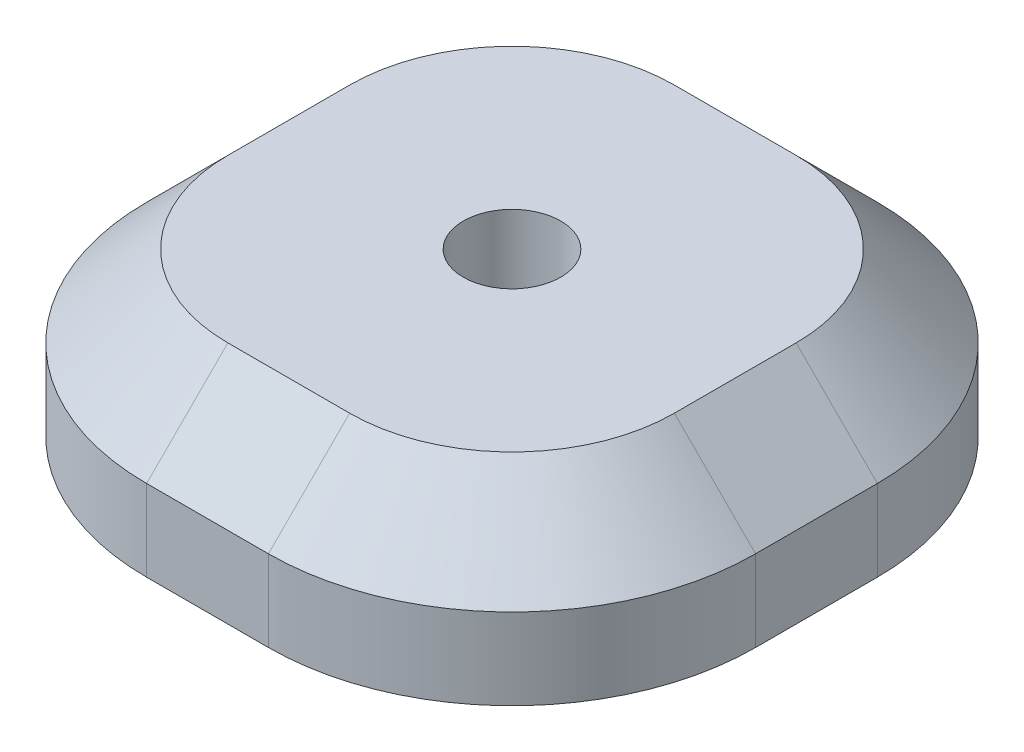
ISO-10303-21;
HEADER;
FILE_DESCRIPTION(('STEP AP214'),'2;1');
FILE_NAME('part.step','',(''),(''),'','','');
FILE_SCHEMA(('AUTOMOTIVE_DESIGN { 1 0 10303 214 1 1 1 1 }'));
ENDSEC;
DATA;
#1=APPLICATION_CONTEXT('core data for automotive mechanical design processes');
#2=APPLICATION_PROTOCOL_DEFINITION('international standard','automotive_design',2000,#1);
#3=PRODUCT_CONTEXT('',#1,'mechanical');
#4=PRODUCT('Part','Part','',(#3));
#5=PRODUCT_RELATED_PRODUCT_CATEGORY('part','',(#4));
#6=PRODUCT_DEFINITION_FORMATION('','',#4);
#7=PRODUCT_DEFINITION_CONTEXT('part definition',#1,'design');
#8=PRODUCT_DEFINITION('design','',#6,#7);
#9=PRODUCT_DEFINITION_SHAPE('','',#8);
#10=(LENGTH_UNIT() NAMED_UNIT(*) SI_UNIT(.MILLI.,.METRE.));
#11=(NAMED_UNIT(*) PLANE_ANGLE_UNIT() SI_UNIT($,.RADIAN.));
#12=(NAMED_UNIT(*) SI_UNIT($,.STERADIAN.) SOLID_ANGLE_UNIT());
#13=UNCERTAINTY_MEASURE_WITH_UNIT(LENGTH_MEASURE(1.E-05),#10,'distance_accuracy_value','');
#14=(GEOMETRIC_REPRESENTATION_CONTEXT(3) GLOBAL_UNCERTAINTY_ASSIGNED_CONTEXT((#13)) GLOBAL_UNIT_ASSIGNED_CONTEXT((#10,
#11,#12)) REPRESENTATION_CONTEXT('',''));
#15=CARTESIAN_POINT('',(0.,0.,0.));
#16=DIRECTION('',(0.,0.,1.));
#17=DIRECTION('',(1.,0.,0.));
#18=AXIS2_PLACEMENT_3D('',#15,#16,#17);
#19=CARTESIAN_POINT('',(-7.50000000000005,10.,7.49999999999993));
#20=DIRECTION('',(0.,-1.,0.));
#21=DIRECTION('',(0.,0.,-1.));
#22=AXIS2_PLACEMENT_3D('',#19,#20,#21);
#23=CYLINDRICAL_SURFACE('',#22,30.);
#24=DIRECTION('',(0.,-1.,0.));
#25=VECTOR('',#24,1.);
#26=CARTESIAN_POINT('',(-7.50000000000005,10.,37.5));
#27=LINE('',#26,#25);
#28=CARTESIAN_POINT('',(-7.50000000000005,0.,37.5));
#29=VERTEX_POINT('',#28);
#30=CARTESIAN_POINT('',(-7.50000000000005,-10.,37.5));
#31=VERTEX_POINT('',#30);
#32=EDGE_CURVE('E133',#29,#31,#27,.T.);
#33=ORIENTED_EDGE('',*,*,#32,.F.);
#34=CARTESIAN_POINT('',(-7.50000000000005,0.,7.49999999999993));
#35=DIRECTION('',(0.,-1.,0.));
#36=DIRECTION('',(0.,0.,-1.));
#37=AXIS2_PLACEMENT_3D('',#34,#35,#36);
#38=CIRCLE('',#37,30.);
#39=CARTESIAN_POINT('',(-37.5000000000001,0.,7.49999999999993));
#40=VERTEX_POINT('',#39);
#41=EDGE_CURVE('E12',#29,#40,#38,.T.);
#42=ORIENTED_EDGE('',*,*,#41,.T.);
#43=DIRECTION('',(0.,-1.,0.));
#44=VECTOR('',#43,1.);
#45=CARTESIAN_POINT('',(-37.5000000000001,10.,7.49999999999993));
#46=LINE('',#45,#44);
#47=CARTESIAN_POINT('',(-37.5000000000001,-10.,7.49999999999993));
#48=VERTEX_POINT('',#47);
#49=EDGE_CURVE('E156',#40,#48,#46,.T.);
#50=ORIENTED_EDGE('',*,*,#49,.T.);
#51=CARTESIAN_POINT('',(-7.50000000000005,-10.,7.49999999999993));
#52=DIRECTION('',(0.,1.,0.));
#53=DIRECTION('',(0.,0.,-1.));
#54=AXIS2_PLACEMENT_3D('',#51,#52,#53);
#55=CIRCLE('',#54,30.);
#56=EDGE_CURVE('E149',#48,#31,#55,.T.);
#57=ORIENTED_EDGE('',*,*,#56,.T.);
#58=EDGE_LOOP('',(#33,#42,#50,#57));
#59=FACE_BOUND('',#58,.T.);
#60=ADVANCED_FACE('F43',(#59),#23,.T.);
#61=CARTESIAN_POINT('',(7.50000000000005,10.,37.5));
#62=DIRECTION('',(0.,0.,-1.));
#63=DIRECTION('',(-1.,0.,0.));
#64=AXIS2_PLACEMENT_3D('',#61,#62,#63);
#65=PLANE('',#64);
#66=DIRECTION('',(0.,-1.,0.));
#67=VECTOR('',#66,1.);
#68=CARTESIAN_POINT('',(7.50000000000005,10.,37.5));
#69=LINE('',#68,#67);
#70=CARTESIAN_POINT('',(7.50000000000005,0.,37.5));
#71=VERTEX_POINT('',#70);
#72=CARTESIAN_POINT('',(7.50000000000005,-10.,37.5));
#73=VERTEX_POINT('',#72);
#74=EDGE_CURVE('E143',#71,#73,#69,.T.);
#75=ORIENTED_EDGE('',*,*,#74,.F.);
#76=DIRECTION('',(-1.,0.,0.));
#77=VECTOR('',#76,1.);
#78=CARTESIAN_POINT('',(7.50000000000005,0.,37.5));
#79=LINE('',#78,#77);
#80=EDGE_CURVE('E54',#71,#29,#79,.T.);
#81=ORIENTED_EDGE('',*,*,#80,.T.);
#82=ORIENTED_EDGE('',*,*,#32,.T.);
#83=DIRECTION('',(1.,0.,0.));
#84=VECTOR('',#83,1.);
#85=CARTESIAN_POINT('',(7.50000000000005,-10.,37.5));
#86=LINE('',#85,#84);
#87=EDGE_CURVE('E136',#31,#73,#86,.T.);
#88=ORIENTED_EDGE('',*,*,#87,.T.);
#89=EDGE_LOOP('',(#75,#81,#82,#88));
#90=FACE_BOUND('',#89,.T.);
#91=ADVANCED_FACE('F135',(#90),#65,.F.);
#92=CARTESIAN_POINT('',(7.50000000000005,10.,7.49999999999993));
#93=DIRECTION('',(0.,-1.,0.));
#94=DIRECTION('',(0.,0.,-1.));
#95=AXIS2_PLACEMENT_3D('',#92,#93,#94);
#96=CYLINDRICAL_SURFACE('',#95,30.);
#97=DIRECTION('',(0.,-1.,0.));
#98=VECTOR('',#97,1.);
#99=CARTESIAN_POINT('',(37.5000000000001,10.,7.49999999999993));
#100=LINE('',#99,#98);
#101=CARTESIAN_POINT('',(37.5000000000001,0.,7.49999999999993));
#102=VERTEX_POINT('',#101);
#103=CARTESIAN_POINT('',(37.5000000000001,-10.,7.49999999999993));
#104=VERTEX_POINT('',#103);
#105=EDGE_CURVE('E202',#102,#104,#100,.T.);
#106=ORIENTED_EDGE('',*,*,#105,.F.);
#107=CARTESIAN_POINT('',(7.50000000000005,0.,7.49999999999993));
#108=DIRECTION('',(0.,-1.,0.));
#109=DIRECTION('',(0.,0.,-1.));
#110=AXIS2_PLACEMENT_3D('',#107,#108,#109);
#111=CIRCLE('',#110,30.);
#112=EDGE_CURVE('E69',#102,#71,#111,.T.);
#113=ORIENTED_EDGE('',*,*,#112,.T.);
#114=ORIENTED_EDGE('',*,*,#74,.T.);
#115=CARTESIAN_POINT('',(7.50000000000005,-10.,7.49999999999993));
#116=DIRECTION('',(0.,1.,0.));
#117=DIRECTION('',(0.,0.,-1.));
#118=AXIS2_PLACEMENT_3D('',#115,#116,#117);
#119=CIRCLE('',#118,30.);
#120=EDGE_CURVE('E152',#73,#104,#119,.T.);
#121=ORIENTED_EDGE('',*,*,#120,.T.);
#122=EDGE_LOOP('',(#106,#113,#114,#121));
#123=FACE_BOUND('',#122,.T.);
#124=ADVANCED_FACE('F329',(#123),#96,.T.);
#125=CARTESIAN_POINT('',(37.5000000000001,10.,-7.49999999999993));
#126=DIRECTION('',(-1.,0.,0.));
#127=DIRECTION('',(0.,0.,1.));
#128=AXIS2_PLACEMENT_3D('',#125,#126,#127);
#129=PLANE('',#128);
#130=DIRECTION('',(0.,-1.,0.));
#131=VECTOR('',#130,1.);
#132=CARTESIAN_POINT('',(37.5000000000001,10.,-7.49999999999993));
#133=LINE('',#132,#131);
#134=CARTESIAN_POINT('',(37.5000000000001,0.,-7.49999999999993));
#135=VERTEX_POINT('',#134);
#136=CARTESIAN_POINT('',(37.5000000000001,-10.,-7.49999999999993));
#137=VERTEX_POINT('',#136);
#138=EDGE_CURVE('E199',#135,#137,#133,.T.);
#139=ORIENTED_EDGE('',*,*,#138,.F.);
#140=DIRECTION('',(0.,0.,1.));
#141=VECTOR('',#140,1.);
#142=CARTESIAN_POINT('',(37.5000000000001,0.,-7.49999999999993));
#143=LINE('',#142,#141);
#144=EDGE_CURVE('E244',#135,#102,#143,.T.);
#145=ORIENTED_EDGE('',*,*,#144,.T.);
#146=ORIENTED_EDGE('',*,*,#105,.T.);
#147=DIRECTION('',(0.,0.,-1.));
#148=VECTOR('',#147,1.);
#149=CARTESIAN_POINT('',(37.5000000000001,-10.,-7.49999999999993));
#150=LINE('',#149,#148);
#151=EDGE_CURVE('E169',#104,#137,#150,.T.);
#152=ORIENTED_EDGE('',*,*,#151,.T.);
#153=EDGE_LOOP('',(#139,#145,#146,#152));
#154=FACE_BOUND('',#153,.T.);
#155=ADVANCED_FACE('F327',(#154),#129,.F.);
#156=CARTESIAN_POINT('',(7.49999999999995,10.,-7.49999999999995));
#157=DIRECTION('',(0.,-1.,0.));
#158=DIRECTION('',(0.,0.,-1.));
#159=AXIS2_PLACEMENT_3D('',#156,#157,#158);
#160=CYLINDRICAL_SURFACE('',#159,30.0000000000001);
#161=DIRECTION('',(0.,-1.,0.));
#162=VECTOR('',#161,1.);
#163=CARTESIAN_POINT('',(7.50000000000005,10.,-37.5));
#164=LINE('',#163,#162);
#165=CARTESIAN_POINT('',(7.50000000000005,0.,-37.5));
#166=VERTEX_POINT('',#165);
#167=CARTESIAN_POINT('',(7.50000000000005,-10.,-37.5));
#168=VERTEX_POINT('',#167);
#169=EDGE_CURVE('E196',#166,#168,#164,.T.);
#170=ORIENTED_EDGE('',*,*,#169,.F.);
#171=CARTESIAN_POINT('',(7.49999999999995,0.,-7.49999999999995));
#172=DIRECTION('',(0.,-1.,0.));
#173=DIRECTION('',(0.,0.,-1.));
#174=AXIS2_PLACEMENT_3D('',#171,#172,#173);
#175=CIRCLE('',#174,30.0000000000001);
#176=EDGE_CURVE('E241',#166,#135,#175,.T.);
#177=ORIENTED_EDGE('',*,*,#176,.T.);
#178=ORIENTED_EDGE('',*,*,#138,.T.);
#179=CARTESIAN_POINT('',(7.49999999999995,-10.,-7.49999999999995));
#180=DIRECTION('',(0.,1.,0.));
#181=DIRECTION('',(0.,0.,-1.));
#182=AXIS2_PLACEMENT_3D('',#179,#180,#181);
#183=CIRCLE('',#182,30.0000000000001);
#184=EDGE_CURVE('E173',#137,#168,#183,.T.);
#185=ORIENTED_EDGE('',*,*,#184,.T.);
#186=EDGE_LOOP('',(#170,#177,#178,#185));
#187=FACE_BOUND('',#186,.T.);
#188=ADVANCED_FACE('F325',(#187),#160,.T.);
#189=CARTESIAN_POINT('',(-7.50000000000005,10.,-37.5));
#190=DIRECTION('',(0.,0.,1.));
#191=DIRECTION('',(1.,0.,0.));
#192=AXIS2_PLACEMENT_3D('',#189,#190,#191);
#193=PLANE('',#192);
#194=DIRECTION('',(0.,-1.,0.));
#195=VECTOR('',#194,1.);
#196=CARTESIAN_POINT('',(-7.50000000000005,10.,-37.5));
#197=LINE('',#196,#195);
#198=CARTESIAN_POINT('',(-7.50000000000005,0.,-37.5));
#199=VERTEX_POINT('',#198);
#200=CARTESIAN_POINT('',(-7.50000000000005,-10.,-37.5));
#201=VERTEX_POINT('',#200);
#202=EDGE_CURVE('E193',#199,#201,#197,.T.);
#203=ORIENTED_EDGE('',*,*,#202,.F.);
#204=DIRECTION('',(1.,0.,0.));
#205=VECTOR('',#204,1.);
#206=CARTESIAN_POINT('',(-7.50000000000005,0.,-37.5));
#207=LINE('',#206,#205);
#208=EDGE_CURVE('E238',#199,#166,#207,.T.);
#209=ORIENTED_EDGE('',*,*,#208,.T.);
#210=ORIENTED_EDGE('',*,*,#169,.T.);
#211=DIRECTION('',(-1.,0.,0.));
#212=VECTOR('',#211,1.);
#213=CARTESIAN_POINT('',(-7.50000000000005,-10.,-37.5));
#214=LINE('',#213,#212);
#215=EDGE_CURVE('E177',#168,#201,#214,.T.);
#216=ORIENTED_EDGE('',*,*,#215,.T.);
#217=EDGE_LOOP('',(#203,#209,#210,#216));
#218=FACE_BOUND('',#217,.T.);
#219=ADVANCED_FACE('F313',(#218),#193,.F.);
#220=CARTESIAN_POINT('',(-7.49999999999995,10.,-7.49999999999993));
#221=DIRECTION('',(0.,-1.,0.));
#222=DIRECTION('',(0.,0.,-1.));
#223=AXIS2_PLACEMENT_3D('',#220,#221,#222);
#224=CYLINDRICAL_SURFACE('',#223,30.0000000000001);
#225=DIRECTION('',(0.,-1.,0.));
#226=VECTOR('',#225,1.);
#227=CARTESIAN_POINT('',(-37.5,10.,-7.49999999999994));
#228=LINE('',#227,#226);
#229=CARTESIAN_POINT('',(-37.5,0.,-7.49999999999994));
#230=VERTEX_POINT('',#229);
#231=CARTESIAN_POINT('',(-37.5,-10.,-7.49999999999994));
#232=VERTEX_POINT('',#231);
#233=EDGE_CURVE('E190',#230,#232,#228,.T.);
#234=ORIENTED_EDGE('',*,*,#233,.F.);
#235=CARTESIAN_POINT('',(-7.49999999999995,0.,-7.49999999999993));
#236=DIRECTION('',(0.,-1.,0.));
#237=DIRECTION('',(0.,0.,-1.));
#238=AXIS2_PLACEMENT_3D('',#235,#236,#237);
#239=CIRCLE('',#238,30.0000000000001);
#240=EDGE_CURVE('E235',#230,#199,#239,.T.);
#241=ORIENTED_EDGE('',*,*,#240,.T.);
#242=ORIENTED_EDGE('',*,*,#202,.T.);
#243=CARTESIAN_POINT('',(-7.49999999999995,-10.,-7.49999999999993));
#244=DIRECTION('',(0.,1.,0.));
#245=DIRECTION('',(0.,0.,1.));
#246=AXIS2_PLACEMENT_3D('',#243,#244,#245);
#247=CIRCLE('',#246,30.0000000000001);
#248=EDGE_CURVE('E181',#201,#232,#247,.T.);
#249=ORIENTED_EDGE('',*,*,#248,.T.);
#250=EDGE_LOOP('',(#234,#241,#242,#249));
#251=FACE_BOUND('',#250,.T.);
#252=ADVANCED_FACE('F310',(#251),#224,.T.);
#253=CARTESIAN_POINT('',(-37.5000000000001,10.,7.49999999999993));
#254=DIRECTION('',(1.,0.,0.));
#255=DIRECTION('',(0.,0.,-1.));
#256=AXIS2_PLACEMENT_3D('',#253,#254,#255);
#257=PLANE('',#256);
#258=ORIENTED_EDGE('',*,*,#49,.F.);
#259=DIRECTION('',(0.,0.,-1.));
#260=VECTOR('',#259,1.);
#261=CARTESIAN_POINT('',(-37.5000000000001,0.,7.49999999999993));
#262=LINE('',#261,#260);
#263=EDGE_CURVE('E231',#40,#230,#262,.T.);
#264=ORIENTED_EDGE('',*,*,#263,.T.);
#265=ORIENTED_EDGE('',*,*,#233,.T.);
#266=DIRECTION('',(0.,0.,1.));
#267=VECTOR('',#266,1.);
#268=CARTESIAN_POINT('',(-37.5000000000001,-10.,7.49999999999993));
#269=LINE('',#268,#267);
#270=EDGE_CURVE('E185',#232,#48,#269,.T.);
#271=ORIENTED_EDGE('',*,*,#270,.T.);
#272=EDGE_LOOP('',(#258,#264,#265,#271));
#273=FACE_BOUND('',#272,.T.);
#274=ADVANCED_FACE('F297',(#273),#257,.F.);
#275=CARTESIAN_POINT('',(-7.50000000000005,10.,7.49999999999993));
#276=DIRECTION('',(0.,-1.,0.));
#277=DIRECTION('',(0.,0.,-1.));
#278=AXIS2_PLACEMENT_3D('',#275,#276,#277);
#279=PLANE('',#278);
#280=CARTESIAN_POINT('',(0.,10.,0.));
#281=DIRECTION('',(0.,1.,0.));
#282=DIRECTION('',(0.,0.,1.));
#283=AXIS2_PLACEMENT_3D('',#280,#281,#282);
#284=CIRCLE('',#283,6.);
#285=CARTESIAN_POINT('',(0.,10.,6.));
#286=VERTEX_POINT('',#285);
#287=EDGE_CURVE('E522',#286,#286,#284,.T.);
#288=ORIENTED_EDGE('',*,*,#287,.F.);
#289=EDGE_LOOP('',(#288));
#290=FACE_BOUND('',#289,.T.);
#291=CARTESIAN_POINT('',(-7.49999999999995,10.,-7.49999999999993));
#292=DIRECTION('',(0.,-1.,0.));
#293=DIRECTION('',(0.,0.,-1.));
#294=AXIS2_PLACEMENT_3D('',#291,#292,#293);
#295=CIRCLE('',#294,20.);
#296=CARTESIAN_POINT('',(-7.50000000000002,10.,-27.4999999999999));
#297=VERTEX_POINT('',#296);
#298=CARTESIAN_POINT('',(-27.5,10.,-7.49999999999994));
#299=VERTEX_POINT('',#298);
#300=EDGE_CURVE('E224',#297,#299,#295,.F.);
#301=ORIENTED_EDGE('',*,*,#300,.T.);
#302=DIRECTION('',(0.,0.,1.));
#303=VECTOR('',#302,1.);
#304=CARTESIAN_POINT('',(-27.5,10.,7.49999999999993));
#305=LINE('',#304,#303);
#306=CARTESIAN_POINT('',(-27.5,10.,7.49999999999993));
#307=VERTEX_POINT('',#306);
#308=EDGE_CURVE('E227',#299,#307,#305,.T.);
#309=ORIENTED_EDGE('',*,*,#308,.T.);
#310=CARTESIAN_POINT('',(-7.50000000000005,10.,7.49999999999993));
#311=DIRECTION('',(0.,-1.,0.));
#312=DIRECTION('',(0.,0.,-1.));
#313=AXIS2_PLACEMENT_3D('',#310,#311,#312);
#314=CIRCLE('',#313,20.);
#315=CARTESIAN_POINT('',(-7.50000000000005,10.,27.4999999999999));
#316=VERTEX_POINT('',#315);
#317=EDGE_CURVE('E142',#307,#316,#314,.F.);
#318=ORIENTED_EDGE('',*,*,#317,.T.);
#319=DIRECTION('',(1.,0.,0.));
#320=VECTOR('',#319,1.);
#321=CARTESIAN_POINT('',(-7.50000000000005,10.,27.4999999999999));
#322=LINE('',#321,#320);
#323=CARTESIAN_POINT('',(7.50000000000005,10.,27.4999999999999));
#324=VERTEX_POINT('',#323);
#325=EDGE_CURVE('E209',#316,#324,#322,.T.);
#326=ORIENTED_EDGE('',*,*,#325,.T.);
#327=CARTESIAN_POINT('',(7.50000000000005,10.,7.49999999999993));
#328=DIRECTION('',(0.,-1.,0.));
#329=DIRECTION('',(0.,0.,-1.));
#330=AXIS2_PLACEMENT_3D('',#327,#328,#329);
#331=CIRCLE('',#330,20.);
#332=CARTESIAN_POINT('',(27.5,10.,7.49999999999993));
#333=VERTEX_POINT('',#332);
#334=EDGE_CURVE('E212',#324,#333,#331,.F.);
#335=ORIENTED_EDGE('',*,*,#334,.T.);
#336=DIRECTION('',(0.,0.,-1.));
#337=VECTOR('',#336,1.);
#338=CARTESIAN_POINT('',(27.5,10.,7.49999999999993));
#339=LINE('',#338,#337);
#340=CARTESIAN_POINT('',(27.5,10.,-7.49999999999994));
#341=VERTEX_POINT('',#340);
#342=EDGE_CURVE('E215',#333,#341,#339,.T.);
#343=ORIENTED_EDGE('',*,*,#342,.T.);
#344=CARTESIAN_POINT('',(7.49999999999995,10.,-7.49999999999995));
#345=DIRECTION('',(0.,-1.,0.));
#346=DIRECTION('',(0.,0.,-1.));
#347=AXIS2_PLACEMENT_3D('',#344,#345,#346);
#348=CIRCLE('',#347,20.);
#349=CARTESIAN_POINT('',(7.50000000000005,10.,-27.5));
#350=VERTEX_POINT('',#349);
#351=EDGE_CURVE('E218',#341,#350,#348,.F.);
#352=ORIENTED_EDGE('',*,*,#351,.T.);
#353=DIRECTION('',(-1.,0.,0.));
#354=VECTOR('',#353,1.);
#355=CARTESIAN_POINT('',(-7.50000000000005,10.,-27.4999999999999));
#356=LINE('',#355,#354);
#357=EDGE_CURVE('E221',#350,#297,#356,.T.);
#358=ORIENTED_EDGE('',*,*,#357,.T.);
#359=EDGE_LOOP('',(#301,#309,#318,#326,#335,#343,#352,#358));
#360=FACE_BOUND('',#359,.T.);
#361=ADVANCED_FACE('F285',(#290,#360),#279,.F.);
#362=CARTESIAN_POINT('',(-7.50000000000005,-10.,7.49999999999993));
#363=DIRECTION('',(0.,-1.,0.));
#364=DIRECTION('',(0.,0.,-1.));
#365=AXIS2_PLACEMENT_3D('',#362,#363,#364);
#366=PLANE('',#365);
#367=CARTESIAN_POINT('',(-12.5,-10.,12.5));
#368=DIRECTION('',(0.,-1.,0.));
#369=DIRECTION('',(0.,0.,1.));
#370=AXIS2_PLACEMENT_3D('',#367,#368,#369);
#371=CIRCLE('',#370,6.);
#372=CARTESIAN_POINT('',(-12.5,-10.,18.5));
#373=VERTEX_POINT('',#372);
#374=EDGE_CURVE('E496',#373,#373,#371,.T.);
#375=ORIENTED_EDGE('',*,*,#374,.F.);
#376=EDGE_LOOP('',(#375));
#377=FACE_BOUND('',#376,.T.);
#378=CARTESIAN_POINT('',(12.5000000000001,-10.,-12.5));
#379=DIRECTION('',(0.,-1.,0.));
#380=DIRECTION('',(0.,0.,1.));
#381=AXIS2_PLACEMENT_3D('',#378,#379,#380);
#382=CIRCLE('',#381,6.00000000000001);
#383=CARTESIAN_POINT('',(12.5000000000001,-10.,-6.49999999999996));
#384=VERTEX_POINT('',#383);
#385=EDGE_CURVE('E503',#384,#384,#382,.T.);
#386=ORIENTED_EDGE('',*,*,#385,.F.);
#387=EDGE_LOOP('',(#386));
#388=FACE_BOUND('',#387,.T.);
#389=CARTESIAN_POINT('',(-12.5,-10.,-12.5));
#390=DIRECTION('',(0.,-1.,0.));
#391=DIRECTION('',(0.,0.,-1.));
#392=AXIS2_PLACEMENT_3D('',#389,#390,#391);
#393=CIRCLE('',#392,6.);
#394=CARTESIAN_POINT('',(-12.5,-10.,-18.5));
#395=VERTEX_POINT('',#394);
#396=EDGE_CURVE('E514',#395,#395,#393,.T.);
#397=ORIENTED_EDGE('',*,*,#396,.F.);
#398=EDGE_LOOP('',(#397));
#399=FACE_BOUND('',#398,.T.);
#400=CARTESIAN_POINT('',(12.5000000000001,-10.,12.5));
#401=DIRECTION('',(0.,-1.,0.));
#402=DIRECTION('',(0.,0.,-1.));
#403=AXIS2_PLACEMENT_3D('',#400,#401,#402);
#404=CIRCLE('',#403,6.00000000000001);
#405=CARTESIAN_POINT('',(12.5000000000001,-10.,6.49999999999996));
#406=VERTEX_POINT('',#405);
#407=EDGE_CURVE('E489',#406,#406,#404,.T.);
#408=ORIENTED_EDGE('',*,*,#407,.F.);
#409=EDGE_LOOP('',(#408));
#410=FACE_BOUND('',#409,.T.);
#411=ORIENTED_EDGE('',*,*,#56,.F.);
#412=ORIENTED_EDGE('',*,*,#270,.F.);
#413=ORIENTED_EDGE('',*,*,#248,.F.);
#414=ORIENTED_EDGE('',*,*,#215,.F.);
#415=ORIENTED_EDGE('',*,*,#184,.F.);
#416=ORIENTED_EDGE('',*,*,#151,.F.);
#417=ORIENTED_EDGE('',*,*,#120,.F.);
#418=ORIENTED_EDGE('',*,*,#87,.F.);
#419=EDGE_LOOP('',(#411,#412,#413,#414,#415,#416,#417,#418));
#420=FACE_BOUND('',#419,.T.);
#421=ADVANCED_FACE('F147',(#377,#388,#399,#410,#420),#366,.T.);
#422=CARTESIAN_POINT('',(27.5,10.,7.49999999999993));
#423=DIRECTION('',(-0.707106781186549,-0.707106781186546,0.));
#424=DIRECTION('',(0.,0.,-1.));
#425=AXIS2_PLACEMENT_3D('',#422,#423,#424);
#426=PLANE('',#425);
#427=DIRECTION('',(-0.707106781186546,0.707106781186549,0.));
#428=VECTOR('',#427,1.);
#429=CARTESIAN_POINT('',(37.5000000000001,0.,7.49999999999993));
#430=LINE('',#429,#428);
#431=EDGE_CURVE('E162',#102,#333,#430,.T.);
#432=ORIENTED_EDGE('',*,*,#431,.F.);
#433=ORIENTED_EDGE('',*,*,#144,.F.);
#434=DIRECTION('',(0.707106781186546,-0.707106781186549,0.));
#435=VECTOR('',#434,1.);
#436=CARTESIAN_POINT('',(27.5,10.,-7.49999999999994));
#437=LINE('',#436,#435);
#438=EDGE_CURVE('E48',#341,#135,#437,.T.);
#439=ORIENTED_EDGE('',*,*,#438,.F.);
#440=ORIENTED_EDGE('',*,*,#342,.F.);
#441=EDGE_LOOP('',(#432,#433,#439,#440));
#442=FACE_BOUND('',#441,.T.);
#443=ADVANCED_FACE('F46',(#442),#426,.F.);
#444=CARTESIAN_POINT('',(7.49999999999995,10.,-7.49999999999995));
#445=DIRECTION('',(0.,-1.,0.));
#446=DIRECTION('',(0.,0.,-1.));
#447=AXIS2_PLACEMENT_3D('',#444,#445,#446);
#448=CONICAL_SURFACE('',#447,20.,0.785398163397447);
#449=ORIENTED_EDGE('',*,*,#438,.T.);
#450=ORIENTED_EDGE('',*,*,#176,.F.);
#451=DIRECTION('',(0.,-0.707106781186549,-0.707106781186546));
#452=VECTOR('',#451,1.);
#453=CARTESIAN_POINT('',(7.50000000000005,10.,-27.5));
#454=LINE('',#453,#452);
#455=EDGE_CURVE('E269',#350,#166,#454,.T.);
#456=ORIENTED_EDGE('',*,*,#455,.F.);
#457=ORIENTED_EDGE('',*,*,#351,.F.);
#458=EDGE_LOOP('',(#449,#450,#456,#457));
#459=FACE_BOUND('',#458,.T.);
#460=ADVANCED_FACE('F322',(#459),#448,.T.);
#461=CARTESIAN_POINT('',(7.50000000000005,10.,7.49999999999993));
#462=DIRECTION('',(0.,-1.,0.));
#463=DIRECTION('',(0.,0.,-1.));
#464=AXIS2_PLACEMENT_3D('',#461,#462,#463);
#465=CONICAL_SURFACE('',#464,20.,0.785398163397447);
#466=ORIENTED_EDGE('',*,*,#431,.T.);
#467=ORIENTED_EDGE('',*,*,#334,.F.);
#468=DIRECTION('',(0.,0.707106781186549,-0.707106781186546));
#469=VECTOR('',#468,1.);
#470=CARTESIAN_POINT('',(7.50000000000005,0.,37.5));
#471=LINE('',#470,#469);
#472=EDGE_CURVE('E265',#71,#324,#471,.T.);
#473=ORIENTED_EDGE('',*,*,#472,.F.);
#474=ORIENTED_EDGE('',*,*,#112,.F.);
#475=EDGE_LOOP('',(#466,#467,#473,#474));
#476=FACE_BOUND('',#475,.T.);
#477=ADVANCED_FACE('F277',(#476),#465,.T.);
#478=CARTESIAN_POINT('',(-7.50000000000005,10.,-27.4999999999999));
#479=DIRECTION('',(0.,-0.707106781186546,0.707106781186549));
#480=DIRECTION('',(-1.,0.,0.));
#481=AXIS2_PLACEMENT_3D('',#478,#479,#480);
#482=PLANE('',#481);
#483=ORIENTED_EDGE('',*,*,#455,.T.);
#484=ORIENTED_EDGE('',*,*,#208,.F.);
#485=DIRECTION('',(0.,-0.707106781186549,-0.707106781186546));
#486=VECTOR('',#485,1.);
#487=CARTESIAN_POINT('',(-7.50000000000002,10.,-27.4999999999999));
#488=LINE('',#487,#486);
#489=EDGE_CURVE('E261',#297,#199,#488,.T.);
#490=ORIENTED_EDGE('',*,*,#489,.F.);
#491=ORIENTED_EDGE('',*,*,#357,.F.);
#492=EDGE_LOOP('',(#483,#484,#490,#491));
#493=FACE_BOUND('',#492,.T.);
#494=ADVANCED_FACE('F318',(#493),#482,.F.);
#495=CARTESIAN_POINT('',(-7.50000000000005,10.,27.4999999999999));
#496=DIRECTION('',(0.,-0.707106781186546,-0.707106781186549));
#497=DIRECTION('',(1.,0.,0.));
#498=AXIS2_PLACEMENT_3D('',#495,#496,#497);
#499=PLANE('',#498);
#500=ORIENTED_EDGE('',*,*,#472,.T.);
#501=ORIENTED_EDGE('',*,*,#325,.F.);
#502=DIRECTION('',(0.,0.707106781186549,-0.707106781186546));
#503=VECTOR('',#502,1.);
#504=CARTESIAN_POINT('',(-7.50000000000005,0.,37.5));
#505=LINE('',#504,#503);
#506=EDGE_CURVE('E257',#29,#316,#505,.T.);
#507=ORIENTED_EDGE('',*,*,#506,.F.);
#508=ORIENTED_EDGE('',*,*,#80,.F.);
#509=EDGE_LOOP('',(#500,#501,#507,#508));
#510=FACE_BOUND('',#509,.T.);
#511=ADVANCED_FACE('F290',(#510),#499,.F.);
#512=CARTESIAN_POINT('',(-7.49999999999995,10.,-7.49999999999993));
#513=DIRECTION('',(0.,-1.,0.));
#514=DIRECTION('',(0.,0.,-1.));
#515=AXIS2_PLACEMENT_3D('',#512,#513,#514);
#516=CONICAL_SURFACE('',#515,20.,0.785398163397447);
#517=ORIENTED_EDGE('',*,*,#489,.T.);
#518=ORIENTED_EDGE('',*,*,#240,.F.);
#519=DIRECTION('',(-0.707106781186546,-0.707106781186549,0.));
#520=VECTOR('',#519,1.);
#521=CARTESIAN_POINT('',(-27.5,10.,-7.49999999999994));
#522=LINE('',#521,#520);
#523=EDGE_CURVE('E254',#299,#230,#522,.T.);
#524=ORIENTED_EDGE('',*,*,#523,.F.);
#525=ORIENTED_EDGE('',*,*,#300,.F.);
#526=EDGE_LOOP('',(#517,#518,#524,#525));
#527=FACE_BOUND('',#526,.T.);
#528=ADVANCED_FACE('F306',(#527),#516,.T.);
#529=CARTESIAN_POINT('',(-7.50000000000005,10.,7.49999999999993));
#530=DIRECTION('',(0.,-1.,0.));
#531=DIRECTION('',(0.,0.,-1.));
#532=AXIS2_PLACEMENT_3D('',#529,#530,#531);
#533=CONICAL_SURFACE('',#532,20.,0.785398163397447);
#534=ORIENTED_EDGE('',*,*,#506,.T.);
#535=ORIENTED_EDGE('',*,*,#317,.F.);
#536=DIRECTION('',(0.707106781186546,0.707106781186549,0.));
#537=VECTOR('',#536,1.);
#538=CARTESIAN_POINT('',(-37.5000000000001,0.,7.49999999999993));
#539=LINE('',#538,#537);
#540=EDGE_CURVE('E251',#40,#307,#539,.T.);
#541=ORIENTED_EDGE('',*,*,#540,.F.);
#542=ORIENTED_EDGE('',*,*,#41,.F.);
#543=EDGE_LOOP('',(#534,#535,#541,#542));
#544=FACE_BOUND('',#543,.T.);
#545=ADVANCED_FACE('F293',(#544),#533,.T.);
#546=CARTESIAN_POINT('',(-27.5,10.,7.49999999999993));
#547=DIRECTION('',(0.707106781186549,-0.707106781186546,0.));
#548=DIRECTION('',(0.,0.,1.));
#549=AXIS2_PLACEMENT_3D('',#546,#547,#548);
#550=PLANE('',#549);
#551=ORIENTED_EDGE('',*,*,#523,.T.);
#552=ORIENTED_EDGE('',*,*,#263,.F.);
#553=ORIENTED_EDGE('',*,*,#540,.T.);
#554=ORIENTED_EDGE('',*,*,#308,.F.);
#555=EDGE_LOOP('',(#551,#552,#553,#554));
#556=FACE_BOUND('',#555,.T.);
#557=ADVANCED_FACE('F300',(#556),#550,.F.);
#558=CARTESIAN_POINT('',(12.5000000000001,26.9705627484772,12.5));
#559=DIRECTION('',(0.,-1.,0.));
#560=DIRECTION('',(0.,0.,-1.));
#561=AXIS2_PLACEMENT_3D('',#558,#559,#560);
#562=CYLINDRICAL_SURFACE('',#561,6.00000000000001);
#563=CARTESIAN_POINT('',(12.5000000000001,0.,12.5));
#564=DIRECTION('',(0.,-1.,0.));
#565=DIRECTION('',(0.,0.,-1.));
#566=AXIS2_PLACEMENT_3D('',#563,#564,#565);
#567=CIRCLE('',#566,6.00000000000001);
#568=CARTESIAN_POINT('',(12.5000000000001,0.,6.49999999999996));
#569=VERTEX_POINT('',#568);
#570=EDGE_CURVE('E164',#569,#569,#567,.F.);
#571=ORIENTED_EDGE('',*,*,#570,.T.);
#572=EDGE_LOOP('',(#571));
#573=FACE_BOUND('',#572,.T.);
#574=ORIENTED_EDGE('',*,*,#407,.T.);
#575=EDGE_LOOP('',(#574));
#576=FACE_BOUND('',#575,.T.);
#577=ADVANCED_FACE('F349',(#573,#576),#562,.F.);
#578=CARTESIAN_POINT('',(-7.50000000000005,0.,7.49999999999993));
#579=DIRECTION('',(0.,-1.,0.));
#580=DIRECTION('',(0.,0.,-1.));
#581=AXIS2_PLACEMENT_3D('',#578,#579,#580);
#582=PLANE('',#581);
#583=ORIENTED_EDGE('',*,*,#570,.F.);
#584=EDGE_LOOP('',(#583));
#585=FACE_BOUND('',#584,.T.);
#586=ADVANCED_FACE('F463',(#585),#582,.T.);
#587=CARTESIAN_POINT('',(-12.5,26.9705627484772,-12.5));
#588=DIRECTION('',(0.,-1.,0.));
#589=DIRECTION('',(0.,0.,-1.));
#590=AXIS2_PLACEMENT_3D('',#587,#588,#589);
#591=CYLINDRICAL_SURFACE('',#590,6.);
#592=CARTESIAN_POINT('',(-12.5,0.,-12.5));
#593=DIRECTION('',(0.,-1.,0.));
#594=DIRECTION('',(0.,0.,-1.));
#595=AXIS2_PLACEMENT_3D('',#592,#593,#594);
#596=CIRCLE('',#595,6.);
#597=CARTESIAN_POINT('',(-12.5,0.,-18.5));
#598=VERTEX_POINT('',#597);
#599=EDGE_CURVE('E506',#598,#598,#596,.F.);
#600=ORIENTED_EDGE('',*,*,#599,.T.);
#601=EDGE_LOOP('',(#600));
#602=FACE_BOUND('',#601,.T.);
#603=ORIENTED_EDGE('',*,*,#396,.T.);
#604=EDGE_LOOP('',(#603));
#605=FACE_BOUND('',#604,.T.);
#606=ADVANCED_FACE('F459',(#602,#605),#591,.F.);
#607=CARTESIAN_POINT('',(-7.50000000000005,0.,7.49999999999993));
#608=DIRECTION('',(0.,-1.,0.));
#609=DIRECTION('',(0.,0.,-1.));
#610=AXIS2_PLACEMENT_3D('',#607,#608,#609);
#611=PLANE('',#610);
#612=ORIENTED_EDGE('',*,*,#599,.F.);
#613=EDGE_LOOP('',(#612));
#614=FACE_BOUND('',#613,.T.);
#615=ADVANCED_FACE('F455',(#614),#611,.T.);
#616=CARTESIAN_POINT('',(12.5000000000001,26.9705627484772,-12.5));
#617=DIRECTION('',(0.,-1.,0.));
#618=DIRECTION('',(0.,0.,-1.));
#619=AXIS2_PLACEMENT_3D('',#616,#617,#618);
#620=CYLINDRICAL_SURFACE('',#619,6.00000000000001);
#621=CARTESIAN_POINT('',(12.5000000000001,0.,-12.5));
#622=DIRECTION('',(0.,-1.,0.));
#623=DIRECTION('',(0.,0.,-1.));
#624=AXIS2_PLACEMENT_3D('',#621,#622,#623);
#625=CIRCLE('',#624,6.00000000000001);
#626=CARTESIAN_POINT('',(12.5000000000001,0.,-18.5));
#627=VERTEX_POINT('',#626);
#628=EDGE_CURVE('E499',#627,#627,#625,.F.);
#629=ORIENTED_EDGE('',*,*,#628,.T.);
#630=EDGE_LOOP('',(#629));
#631=FACE_BOUND('',#630,.T.);
#632=ORIENTED_EDGE('',*,*,#385,.T.);
#633=EDGE_LOOP('',(#632));
#634=FACE_BOUND('',#633,.T.);
#635=ADVANCED_FACE('F458',(#631,#634),#620,.F.);
#636=CARTESIAN_POINT('',(-7.50000000000005,0.,7.49999999999993));
#637=DIRECTION('',(0.,-1.,0.));
#638=DIRECTION('',(0.,0.,-1.));
#639=AXIS2_PLACEMENT_3D('',#636,#637,#638);
#640=PLANE('',#639);
#641=ORIENTED_EDGE('',*,*,#628,.F.);
#642=EDGE_LOOP('',(#641));
#643=FACE_BOUND('',#642,.T.);
#644=ADVANCED_FACE('F470',(#643),#640,.T.);
#645=CARTESIAN_POINT('',(-12.5,26.9705627484772,12.5));
#646=DIRECTION('',(0.,-1.,0.));
#647=DIRECTION('',(0.,0.,-1.));
#648=AXIS2_PLACEMENT_3D('',#645,#646,#647);
#649=CYLINDRICAL_SURFACE('',#648,6.);
#650=CARTESIAN_POINT('',(-12.5,0.,12.5));
#651=DIRECTION('',(0.,-1.,0.));
#652=DIRECTION('',(0.,0.,-1.));
#653=AXIS2_PLACEMENT_3D('',#650,#651,#652);
#654=CIRCLE('',#653,6.);
#655=CARTESIAN_POINT('',(-12.5,0.,6.49999999999995));
#656=VERTEX_POINT('',#655);
#657=EDGE_CURVE('E492',#656,#656,#654,.F.);
#658=ORIENTED_EDGE('',*,*,#657,.T.);
#659=EDGE_LOOP('',(#658));
#660=FACE_BOUND('',#659,.T.);
#661=ORIENTED_EDGE('',*,*,#374,.T.);
#662=EDGE_LOOP('',(#661));
#663=FACE_BOUND('',#662,.T.);
#664=ADVANCED_FACE('F466',(#660,#663),#649,.F.);
#665=CARTESIAN_POINT('',(-7.50000000000005,0.,7.49999999999993));
#666=DIRECTION('',(0.,-1.,0.));
#667=DIRECTION('',(0.,0.,-1.));
#668=AXIS2_PLACEMENT_3D('',#665,#666,#667);
#669=PLANE('',#668);
#670=ORIENTED_EDGE('',*,*,#657,.F.);
#671=EDGE_LOOP('',(#670));
#672=FACE_BOUND('',#671,.T.);
#673=ADVANCED_FACE('F428',(#672),#669,.T.);
#674=CARTESIAN_POINT('',(-7.50000000000005,0.,7.49999999999993));
#675=DIRECTION('',(0.,-1.,0.));
#676=DIRECTION('',(0.,0.,-1.));
#677=AXIS2_PLACEMENT_3D('',#674,#675,#676);
#678=PLANE('',#677);
#679=CARTESIAN_POINT('',(0.,0.,0.));
#680=DIRECTION('',(0.,-1.,0.));
#681=DIRECTION('',(0.,0.,-1.));
#682=AXIS2_PLACEMENT_3D('',#679,#680,#681);
#683=CIRCLE('',#682,6.);
#684=CARTESIAN_POINT('',(0.,0.,-6.));
#685=VERTEX_POINT('',#684);
#686=EDGE_CURVE('E518',#685,#685,#683,.F.);
#687=ORIENTED_EDGE('',*,*,#686,.T.);
#688=EDGE_LOOP('',(#687));
#689=FACE_BOUND('',#688,.T.);
#690=ADVANCED_FACE('F433',(#689),#678,.F.);
#691=CARTESIAN_POINT('',(0.,-26.9705627484771,0.));
#692=DIRECTION('',(0.,1.,0.));
#693=DIRECTION('',(0.,0.,1.));
#694=AXIS2_PLACEMENT_3D('',#691,#692,#693);
#695=CYLINDRICAL_SURFACE('',#694,6.);
#696=ORIENTED_EDGE('',*,*,#287,.T.);
#697=EDGE_LOOP('',(#696));
#698=FACE_BOUND('',#697,.T.);
#699=ORIENTED_EDGE('',*,*,#686,.F.);
#700=EDGE_LOOP('',(#699));
#701=FACE_BOUND('',#700,.T.);
#702=ADVANCED_FACE('F438',(#698,#701),#695,.F.);
#703=CLOSED_SHELL('',(#60,#91,#124,#155,#188,#219,#252,#274,#361,#421,#443,#460,#477,#494,#511,
#528,#545,#557,#577,#586,#606,#615,#635,#644,#664,#673,#690,#702));
#704=MANIFOLD_SOLID_BREP('B2',#703);
#705=ADVANCED_BREP_SHAPE_REPRESENTATION('',(#18,#704),#14);
#706=SHAPE_DEFINITION_REPRESENTATION(#9,#705);
ENDSEC;
END-ISO-10303-21;
